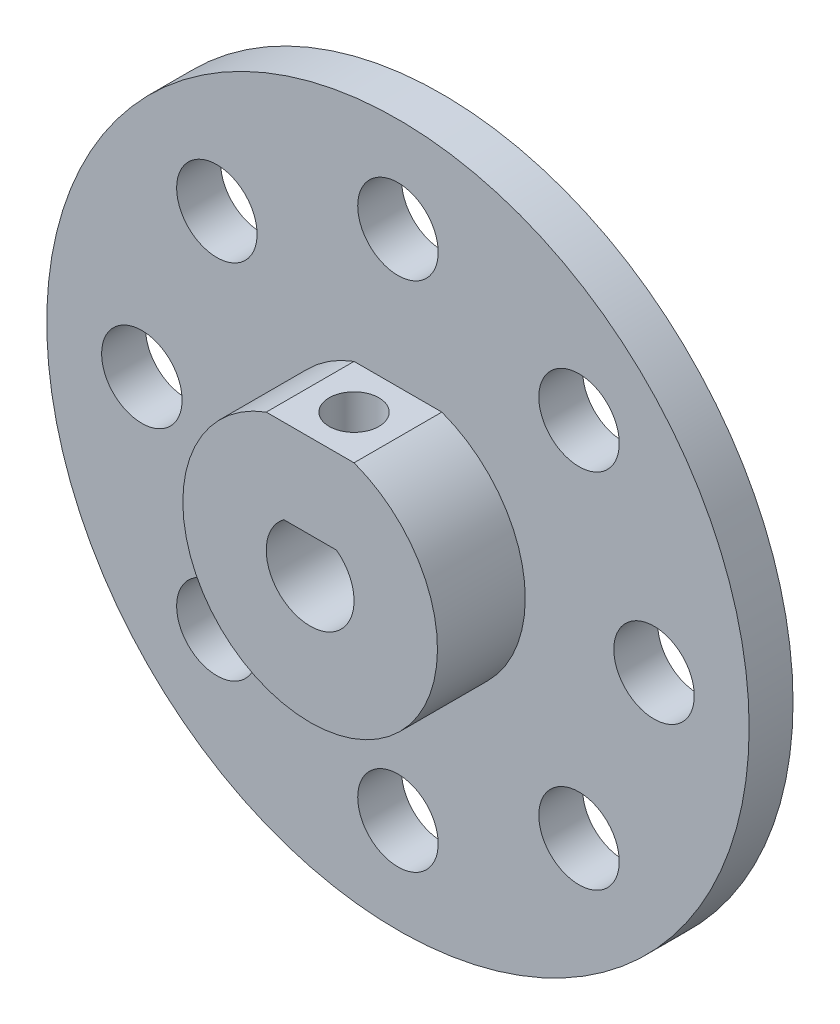
ISO-10303-21;
HEADER;
FILE_DESCRIPTION(('STEP AP214'),'2;1');
FILE_NAME('part.step','',(''),(''),'','','');
FILE_SCHEMA(('AUTOMOTIVE_DESIGN { 1 0 10303 214 1 1 1 1 }'));
ENDSEC;
DATA;
#1=APPLICATION_CONTEXT('core data for automotive mechanical design processes');
#2=APPLICATION_PROTOCOL_DEFINITION('international standard','automotive_design',2000,#1);
#3=PRODUCT_CONTEXT('',#1,'mechanical');
#4=PRODUCT('Part','Part','',(#3));
#5=PRODUCT_RELATED_PRODUCT_CATEGORY('part','',(#4));
#6=PRODUCT_DEFINITION_FORMATION('','',#4);
#7=PRODUCT_DEFINITION_CONTEXT('part definition',#1,'design');
#8=PRODUCT_DEFINITION('design','',#6,#7);
#9=PRODUCT_DEFINITION_SHAPE('','',#8);
#10=(LENGTH_UNIT() NAMED_UNIT(*) SI_UNIT(.MILLI.,.METRE.));
#11=(NAMED_UNIT(*) PLANE_ANGLE_UNIT() SI_UNIT($,.RADIAN.));
#12=(NAMED_UNIT(*) SI_UNIT($,.STERADIAN.) SOLID_ANGLE_UNIT());
#13=UNCERTAINTY_MEASURE_WITH_UNIT(LENGTH_MEASURE(1.E-05),#10,'distance_accuracy_value','');
#14=(GEOMETRIC_REPRESENTATION_CONTEXT(3) GLOBAL_UNCERTAINTY_ASSIGNED_CONTEXT((#13)) GLOBAL_UNIT_ASSIGNED_CONTEXT((#10,
#11,#12)) REPRESENTATION_CONTEXT('',''));
#15=CARTESIAN_POINT('',(0.,0.,0.));
#16=DIRECTION('',(0.,0.,1.));
#17=DIRECTION('',(1.,0.,0.));
#18=AXIS2_PLACEMENT_3D('',#15,#16,#17);
#19=CARTESIAN_POINT('',(0.,9.00000000000001,-3.75));
#20=DIRECTION('',(0.,0.,1.));
#21=DIRECTION('',(1.,0.,0.));
#22=AXIS2_PLACEMENT_3D('',#19,#20,#21);
#23=PLANE('',#22);
#24=CARTESIAN_POINT('',(0.,17.5,-3.75));
#25=DIRECTION('',(0.,0.,-1.));
#26=DIRECTION('',(-1.,0.,0.));
#27=AXIS2_PLACEMENT_3D('',#24,#25,#26);
#28=CIRCLE('',#27,2.74999999999999);
#29=CARTESIAN_POINT('',(-2.74999999999999,17.5,-3.75));
#30=VERTEX_POINT('',#29);
#31=EDGE_CURVE('E221',#30,#30,#28,.T.);
#32=ORIENTED_EDGE('',*,*,#31,.F.);
#33=EDGE_LOOP('',(#32));
#34=FACE_BOUND('',#33,.T.);
#35=CARTESIAN_POINT('',(-9.88330434368617E-13,-17.5,-3.75));
#36=DIRECTION('',(0.,0.,-1.));
#37=DIRECTION('',(-1.,0.,0.));
#38=AXIS2_PLACEMENT_3D('',#35,#36,#37);
#39=CIRCLE('',#38,2.74999999999999);
#40=CARTESIAN_POINT('',(-2.75000000000098,-17.5,-3.75));
#41=VERTEX_POINT('',#40);
#42=EDGE_CURVE('E253',#41,#41,#39,.T.);
#43=ORIENTED_EDGE('',*,*,#42,.F.);
#44=EDGE_LOOP('',(#43));
#45=FACE_BOUND('',#44,.T.);
#46=CARTESIAN_POINT('',(12.3743686707637,-12.3743686707649,-3.75));
#47=DIRECTION('',(0.,0.,-1.));
#48=DIRECTION('',(-1.,0.,0.));
#49=AXIS2_PLACEMENT_3D('',#46,#47,#48);
#50=CIRCLE('',#49,2.74999999999999);
#51=CARTESIAN_POINT('',(9.62436867076375,-12.3743686707649,-3.75));
#52=VERTEX_POINT('',#51);
#53=EDGE_CURVE('E261',#52,#52,#50,.T.);
#54=ORIENTED_EDGE('',*,*,#53,.F.);
#55=EDGE_LOOP('',(#54));
#56=FACE_BOUND('',#55,.T.);
#57=CARTESIAN_POINT('',(12.3743686707644,12.3743686707642,-3.75));
#58=DIRECTION('',(0.,0.,-1.));
#59=DIRECTION('',(-1.,0.,0.));
#60=AXIS2_PLACEMENT_3D('',#57,#58,#59);
#61=CIRCLE('',#60,2.74999999999999);
#62=CARTESIAN_POINT('',(9.62436867076445,12.3743686707642,-3.75));
#63=VERTEX_POINT('',#62);
#64=EDGE_CURVE('E277',#63,#63,#61,.T.);
#65=ORIENTED_EDGE('',*,*,#64,.F.);
#66=EDGE_LOOP('',(#65));
#67=FACE_BOUND('',#66,.T.);
#68=CARTESIAN_POINT('',(0.,0.,-3.74999999999999));
#69=DIRECTION('',(0.,0.,1.));
#70=DIRECTION('',(1.,0.,0.));
#71=AXIS2_PLACEMENT_3D('',#68,#69,#70);
#72=CIRCLE('',#71,24.);
#73=CARTESIAN_POINT('',(24.,0.,-3.74999999999999));
#74=VERTEX_POINT('',#73);
#75=EDGE_CURVE('E111',#74,#74,#72,.T.);
#76=ORIENTED_EDGE('',*,*,#75,.F.);
#77=EDGE_LOOP('',(#76));
#78=FACE_BOUND('',#77,.T.);
#79=CARTESIAN_POINT('',(0.,0.,-3.75));
#80=DIRECTION('',(0.,0.,1.));
#81=DIRECTION('',(1.,0.,0.));
#82=AXIS2_PLACEMENT_3D('',#79,#80,#81);
#83=CIRCLE('',#82,9.00000000000001);
#84=CARTESIAN_POINT('',(9.00000000000001,0.,-3.75));
#85=VERTEX_POINT('',#84);
#86=EDGE_CURVE('E54',#85,#85,#83,.T.);
#87=ORIENTED_EDGE('',*,*,#86,.T.);
#88=EDGE_LOOP('',(#87));
#89=FACE_BOUND('',#88,.T.);
#90=CARTESIAN_POINT('',(17.4999999999995,-4.96308349082816E-13,-3.75));
#91=DIRECTION('',(0.,0.,-1.));
#92=DIRECTION('',(-1.,0.,0.));
#93=AXIS2_PLACEMENT_3D('',#90,#91,#92);
#94=CIRCLE('',#93,2.74999999999999);
#95=CARTESIAN_POINT('',(14.7499999999995,-4.96308349082816E-13,-3.75));
#96=VERTEX_POINT('',#95);
#97=EDGE_CURVE('E269',#96,#96,#94,.T.);
#98=ORIENTED_EDGE('',*,*,#97,.F.);
#99=EDGE_LOOP('',(#98));
#100=FACE_BOUND('',#99,.T.);
#101=CARTESIAN_POINT('',(-12.3743686707654,-12.3743686707642,-3.75));
#102=DIRECTION('',(0.,0.,-1.));
#103=DIRECTION('',(-1.,0.,0.));
#104=AXIS2_PLACEMENT_3D('',#101,#102,#103);
#105=CIRCLE('',#104,2.74999999999999);
#106=CARTESIAN_POINT('',(-15.1243686707654,-12.3743686707642,-3.75));
#107=VERTEX_POINT('',#106);
#108=EDGE_CURVE('E245',#107,#107,#105,.T.);
#109=ORIENTED_EDGE('',*,*,#108,.F.);
#110=EDGE_LOOP('',(#109));
#111=FACE_BOUND('',#110,.T.);
#112=CARTESIAN_POINT('',(-17.5000000000005,4.94165217184309E-13,-3.75));
#113=DIRECTION('',(0.,0.,-1.));
#114=DIRECTION('',(-1.,0.,0.));
#115=AXIS2_PLACEMENT_3D('',#112,#113,#114);
#116=CIRCLE('',#115,2.74999999999999);
#117=CARTESIAN_POINT('',(-20.2500000000005,4.94165217184309E-13,-3.75));
#118=VERTEX_POINT('',#117);
#119=EDGE_CURVE('E237',#118,#118,#116,.T.);
#120=ORIENTED_EDGE('',*,*,#119,.F.);
#121=EDGE_LOOP('',(#120));
#122=FACE_BOUND('',#121,.T.);
#123=CARTESIAN_POINT('',(-12.3743686707646,12.3743686707646,-3.75));
#124=DIRECTION('',(0.,0.,-1.));
#125=DIRECTION('',(-1.,0.,0.));
#126=AXIS2_PLACEMENT_3D('',#123,#124,#125);
#127=CIRCLE('',#126,2.74999999999999);
#128=CARTESIAN_POINT('',(-15.1243686707646,12.3743686707646,-3.75));
#129=VERTEX_POINT('',#128);
#130=EDGE_CURVE('E229',#129,#129,#127,.T.);
#131=ORIENTED_EDGE('',*,*,#130,.F.);
#132=EDGE_LOOP('',(#131));
#133=FACE_BOUND('',#132,.T.);
#134=ADVANCED_FACE('F45',(#34,#45,#56,#67,#78,#89,#100,#111,#122,#133),#23,.F.);
#135=CARTESIAN_POINT('',(0.,8.7,5.25));
#136=DIRECTION('',(0.,0.,-1.));
#137=DIRECTION('',(-1.,0.,0.));
#138=AXIS2_PLACEMENT_3D('',#135,#136,#137);
#139=PLANE('',#138);
#140=DIRECTION('',(-1.,0.,0.));
#141=VECTOR('',#140,1.);
#142=CARTESIAN_POINT('',(-1.8,2.4,5.25));
#143=LINE('',#142,#141);
#144=CARTESIAN_POINT('',(1.8,2.4,5.25));
#145=VERTEX_POINT('',#144);
#146=CARTESIAN_POINT('',(-1.8,2.4,5.25));
#147=VERTEX_POINT('',#146);
#148=EDGE_CURVE('E290',#145,#147,#143,.T.);
#149=ORIENTED_EDGE('',*,*,#148,.F.);
#150=CARTESIAN_POINT('',(0.,0.,5.25));
#151=DIRECTION('',(0.,0.,1.));
#152=DIRECTION('',(1.,0.,0.));
#153=AXIS2_PLACEMENT_3D('',#150,#151,#152);
#154=CIRCLE('',#153,3.);
#155=EDGE_CURVE('E69',#147,#145,#154,.T.);
#156=ORIENTED_EDGE('',*,*,#155,.F.);
#157=EDGE_LOOP('',(#149,#156));
#158=FACE_BOUND('',#157,.T.);
#159=CARTESIAN_POINT('',(0.,0.,5.25));
#160=DIRECTION('',(0.,0.,1.));
#161=DIRECTION('',(1.,0.,0.));
#162=AXIS2_PLACEMENT_3D('',#159,#160,#161);
#163=CIRCLE('',#162,8.7);
#164=CARTESIAN_POINT('',(-3.,8.16639455328973,5.25));
#165=VERTEX_POINT('',#164);
#166=CARTESIAN_POINT('',(3.,8.16639455328973,5.25));
#167=VERTEX_POINT('',#166);
#168=EDGE_CURVE('E106',#165,#167,#163,.T.);
#169=ORIENTED_EDGE('',*,*,#168,.T.);
#170=DIRECTION('',(1.,0.,0.));
#171=VECTOR('',#170,1.);
#172=CARTESIAN_POINT('',(-3.,8.16639455328973,5.25));
#173=LINE('',#172,#171);
#174=EDGE_CURVE('E88',#165,#167,#173,.T.);
#175=ORIENTED_EDGE('',*,*,#174,.F.);
#176=EDGE_LOOP('',(#169,#175));
#177=FACE_BOUND('',#176,.T.);
#178=ADVANCED_FACE('F47',(#158,#177),#139,.F.);
#179=CARTESIAN_POINT('',(0.,0.,-5.25));
#180=DIRECTION('',(0.,0.,1.));
#181=DIRECTION('',(1.,0.,0.));
#182=AXIS2_PLACEMENT_3D('',#179,#180,#181);
#183=PLANE('',#182);
#184=CARTESIAN_POINT('',(0.,0.,-5.25));
#185=DIRECTION('',(0.,0.,1.));
#186=DIRECTION('',(1.,0.,0.));
#187=AXIS2_PLACEMENT_3D('',#184,#185,#186);
#188=CIRCLE('',#187,9.00000000000001);
#189=CARTESIAN_POINT('',(9.00000000000001,0.,-5.25));
#190=VERTEX_POINT('',#189);
#191=EDGE_CURVE('E11',#190,#190,#188,.T.);
#192=ORIENTED_EDGE('',*,*,#191,.F.);
#193=EDGE_LOOP('',(#192));
#194=FACE_BOUND('',#193,.T.);
#195=ADVANCED_FACE('F129',(#194),#183,.F.);
#196=CARTESIAN_POINT('',(0.,0.,25.6232345338686));
#197=DIRECTION('',(0.,0.,1.));
#198=DIRECTION('',(1.,0.,0.));
#199=AXIS2_PLACEMENT_3D('',#196,#197,#198);
#200=CYLINDRICAL_SURFACE('',#199,9.00000000000001);
#201=ORIENTED_EDGE('',*,*,#86,.F.);
#202=EDGE_LOOP('',(#201));
#203=FACE_BOUND('',#202,.T.);
#204=ORIENTED_EDGE('',*,*,#191,.T.);
#205=EDGE_LOOP('',(#204));
#206=FACE_BOUND('',#205,.T.);
#207=ADVANCED_FACE('F125',(#203,#206),#200,.T.);
#208=CARTESIAN_POINT('',(0.,0.,25.6232345338686));
#209=DIRECTION('',(0.,0.,1.));
#210=DIRECTION('',(1.,0.,0.));
#211=AXIS2_PLACEMENT_3D('',#208,#209,#210);
#212=CYLINDRICAL_SURFACE('',#211,24.);
#213=CARTESIAN_POINT('',(0.,0.,-0.749999999999994));
#214=DIRECTION('',(0.,0.,1.));
#215=DIRECTION('',(1.,0.,0.));
#216=AXIS2_PLACEMENT_3D('',#213,#214,#215);
#217=CIRCLE('',#216,24.);
#218=CARTESIAN_POINT('',(24.,0.,-0.749999999999994));
#219=VERTEX_POINT('',#218);
#220=EDGE_CURVE('E105',#219,#219,#217,.T.);
#221=ORIENTED_EDGE('',*,*,#220,.F.);
#222=EDGE_LOOP('',(#221));
#223=FACE_BOUND('',#222,.T.);
#224=ORIENTED_EDGE('',*,*,#75,.T.);
#225=EDGE_LOOP('',(#224));
#226=FACE_BOUND('',#225,.T.);
#227=ADVANCED_FACE('F128',(#223,#226),#212,.T.);
#228=CARTESIAN_POINT('',(0.,24.,-0.749999999999997));
#229=DIRECTION('',(0.,0.,-1.));
#230=DIRECTION('',(-1.,0.,0.));
#231=AXIS2_PLACEMENT_3D('',#228,#229,#230);
#232=PLANE('',#231);
#233=CARTESIAN_POINT('',(0.,17.5,-0.749999999999997));
#234=DIRECTION('',(0.,0.,-1.));
#235=DIRECTION('',(-1.,0.,0.));
#236=AXIS2_PLACEMENT_3D('',#233,#234,#235);
#237=CIRCLE('',#236,2.74999999999999);
#238=CARTESIAN_POINT('',(-2.74999999999999,17.5,-0.749999999999997));
#239=VERTEX_POINT('',#238);
#240=EDGE_CURVE('E225',#239,#239,#237,.T.);
#241=ORIENTED_EDGE('',*,*,#240,.T.);
#242=EDGE_LOOP('',(#241));
#243=FACE_BOUND('',#242,.T.);
#244=CARTESIAN_POINT('',(-12.3743686707646,12.3743686707646,-0.749999999999997));
#245=DIRECTION('',(0.,0.,-1.));
#246=DIRECTION('',(-1.,0.,0.));
#247=AXIS2_PLACEMENT_3D('',#244,#245,#246);
#248=CIRCLE('',#247,2.74999999999999);
#249=CARTESIAN_POINT('',(-15.1243686707646,12.3743686707646,-0.749999999999997));
#250=VERTEX_POINT('',#249);
#251=EDGE_CURVE('E233',#250,#250,#248,.T.);
#252=ORIENTED_EDGE('',*,*,#251,.T.);
#253=EDGE_LOOP('',(#252));
#254=FACE_BOUND('',#253,.T.);
#255=CARTESIAN_POINT('',(-17.5000000000005,4.94165217184309E-13,-0.749999999999997));
#256=DIRECTION('',(0.,0.,-1.));
#257=DIRECTION('',(-1.,0.,0.));
#258=AXIS2_PLACEMENT_3D('',#255,#256,#257);
#259=CIRCLE('',#258,2.74999999999999);
#260=CARTESIAN_POINT('',(-20.2500000000005,4.94165217184309E-13,-0.749999999999997));
#261=VERTEX_POINT('',#260);
#262=EDGE_CURVE('E241',#261,#261,#259,.T.);
#263=ORIENTED_EDGE('',*,*,#262,.T.);
#264=EDGE_LOOP('',(#263));
#265=FACE_BOUND('',#264,.T.);
#266=CARTESIAN_POINT('',(-12.3743686707654,-12.3743686707642,-0.749999999999997));
#267=DIRECTION('',(0.,0.,-1.));
#268=DIRECTION('',(-1.,0.,0.));
#269=AXIS2_PLACEMENT_3D('',#266,#267,#268);
#270=CIRCLE('',#269,2.74999999999999);
#271=CARTESIAN_POINT('',(-15.1243686707654,-12.3743686707642,-0.749999999999997));
#272=VERTEX_POINT('',#271);
#273=EDGE_CURVE('E249',#272,#272,#270,.T.);
#274=ORIENTED_EDGE('',*,*,#273,.T.);
#275=EDGE_LOOP('',(#274));
#276=FACE_BOUND('',#275,.T.);
#277=CARTESIAN_POINT('',(-9.88330434368617E-13,-17.5,-0.749999999999997));
#278=DIRECTION('',(0.,0.,-1.));
#279=DIRECTION('',(-1.,0.,0.));
#280=AXIS2_PLACEMENT_3D('',#277,#278,#279);
#281=CIRCLE('',#280,2.74999999999999);
#282=CARTESIAN_POINT('',(-2.75000000000098,-17.5,-0.749999999999997));
#283=VERTEX_POINT('',#282);
#284=EDGE_CURVE('E257',#283,#283,#281,.T.);
#285=ORIENTED_EDGE('',*,*,#284,.T.);
#286=EDGE_LOOP('',(#285));
#287=FACE_BOUND('',#286,.T.);
#288=CARTESIAN_POINT('',(12.3743686707637,-12.3743686707649,-0.749999999999997));
#289=DIRECTION('',(0.,0.,-1.));
#290=DIRECTION('',(-1.,0.,0.));
#291=AXIS2_PLACEMENT_3D('',#288,#289,#290);
#292=CIRCLE('',#291,2.74999999999999);
#293=CARTESIAN_POINT('',(9.62436867076375,-12.3743686707649,-0.749999999999997));
#294=VERTEX_POINT('',#293);
#295=EDGE_CURVE('E265',#294,#294,#292,.T.);
#296=ORIENTED_EDGE('',*,*,#295,.T.);
#297=EDGE_LOOP('',(#296));
#298=FACE_BOUND('',#297,.T.);
#299=CARTESIAN_POINT('',(17.4999999999995,-4.96308349082816E-13,-0.749999999999997));
#300=DIRECTION('',(0.,0.,-1.));
#301=DIRECTION('',(-1.,0.,0.));
#302=AXIS2_PLACEMENT_3D('',#299,#300,#301);
#303=CIRCLE('',#302,2.74999999999999);
#304=CARTESIAN_POINT('',(14.7499999999995,-4.96308349082816E-13,-0.749999999999997));
#305=VERTEX_POINT('',#304);
#306=EDGE_CURVE('E273',#305,#305,#303,.T.);
#307=ORIENTED_EDGE('',*,*,#306,.T.);
#308=EDGE_LOOP('',(#307));
#309=FACE_BOUND('',#308,.T.);
#310=CARTESIAN_POINT('',(12.3743686707644,12.3743686707642,-0.749999999999997));
#311=DIRECTION('',(0.,0.,-1.));
#312=DIRECTION('',(-1.,0.,0.));
#313=AXIS2_PLACEMENT_3D('',#310,#311,#312);
#314=CIRCLE('',#313,2.74999999999999);
#315=CARTESIAN_POINT('',(9.62436867076445,12.3743686707642,-0.749999999999997));
#316=VERTEX_POINT('',#315);
#317=EDGE_CURVE('E281',#316,#316,#314,.T.);
#318=ORIENTED_EDGE('',*,*,#317,.T.);
#319=EDGE_LOOP('',(#318));
#320=FACE_BOUND('',#319,.T.);
#321=CARTESIAN_POINT('',(0.,0.,-0.750000000000001));
#322=DIRECTION('',(0.,0.,1.));
#323=DIRECTION('',(1.,0.,0.));
#324=AXIS2_PLACEMENT_3D('',#321,#322,#323);
#325=CIRCLE('',#324,8.7);
#326=CARTESIAN_POINT('',(-2.99999999999999,8.16639455328973,-0.750000000000001));
#327=VERTEX_POINT('',#326);
#328=CARTESIAN_POINT('',(3.,8.16639455328973,-0.749999999999997));
#329=VERTEX_POINT('',#328);
#330=EDGE_CURVE('E100',#327,#329,#325,.T.);
#331=ORIENTED_EDGE('',*,*,#330,.F.);
#332=DIRECTION('',(1.,0.,0.));
#333=VECTOR('',#332,1.);
#334=CARTESIAN_POINT('',(-3.,8.16639455328973,-0.749999999999997));
#335=LINE('',#334,#333);
#336=EDGE_CURVE('E61',#327,#329,#335,.T.);
#337=ORIENTED_EDGE('',*,*,#336,.T.);
#338=EDGE_LOOP('',(#331,#337));
#339=FACE_BOUND('',#338,.T.);
#340=ORIENTED_EDGE('',*,*,#220,.T.);
#341=EDGE_LOOP('',(#340));
#342=FACE_BOUND('',#341,.T.);
#343=ADVANCED_FACE('F98',(#243,#254,#265,#276,#287,#298,#309,#320,#339,#342),#232,.F.);
#344=CARTESIAN_POINT('',(0.,0.,25.6232345338686));
#345=DIRECTION('',(0.,0.,1.));
#346=DIRECTION('',(1.,0.,0.));
#347=AXIS2_PLACEMENT_3D('',#344,#345,#346);
#348=CYLINDRICAL_SURFACE('',#347,8.7);
#349=ORIENTED_EDGE('',*,*,#330,.T.);
#350=DIRECTION('',(0.,0.,1.));
#351=VECTOR('',#350,1.);
#352=CARTESIAN_POINT('',(3.,8.16639455328973,-6.77368116460017));
#353=LINE('',#352,#351);
#354=EDGE_CURVE('E85',#329,#167,#353,.T.);
#355=ORIENTED_EDGE('',*,*,#354,.T.);
#356=ORIENTED_EDGE('',*,*,#168,.F.);
#357=DIRECTION('',(0.,0.,1.));
#358=VECTOR('',#357,1.);
#359=CARTESIAN_POINT('',(-3.,8.16639455328973,-6.77368116460017));
#360=LINE('',#359,#358);
#361=EDGE_CURVE('E94',#327,#165,#360,.T.);
#362=ORIENTED_EDGE('',*,*,#361,.F.);
#363=EDGE_LOOP('',(#349,#355,#356,#362));
#364=FACE_BOUND('',#363,.T.);
#365=ADVANCED_FACE('F103',(#364),#348,.T.);
#366=CARTESIAN_POINT('',(0.,0.,-4.75));
#367=DIRECTION('',(0.,0.,1.));
#368=DIRECTION('',(1.,0.,0.));
#369=AXIS2_PLACEMENT_3D('',#366,#367,#368);
#370=CYLINDRICAL_SURFACE('',#369,3.);
#371=ORIENTED_EDGE('',*,*,#155,.T.);
#372=DIRECTION('',(0.,0.,1.));
#373=VECTOR('',#372,1.);
#374=CARTESIAN_POINT('',(1.8,2.4,-4.75));
#375=LINE('',#374,#373);
#376=CARTESIAN_POINT('',(1.8,2.4,-4.75));
#377=VERTEX_POINT('',#376);
#378=EDGE_CURVE('E294',#377,#145,#375,.T.);
#379=ORIENTED_EDGE('',*,*,#378,.F.);
#380=CARTESIAN_POINT('',(0.,0.,-4.75));
#381=DIRECTION('',(0.,0.,1.));
#382=DIRECTION('',(1.,0.,0.));
#383=AXIS2_PLACEMENT_3D('',#380,#381,#382);
#384=CIRCLE('',#383,3.);
#385=CARTESIAN_POINT('',(-1.8,2.4,-4.75));
#386=VERTEX_POINT('',#385);
#387=EDGE_CURVE('E285',#386,#377,#384,.T.);
#388=ORIENTED_EDGE('',*,*,#387,.F.);
#389=DIRECTION('',(0.,0.,1.));
#390=VECTOR('',#389,1.);
#391=CARTESIAN_POINT('',(-1.8,2.4,-4.75));
#392=LINE('',#391,#390);
#393=EDGE_CURVE('E113',#386,#147,#392,.T.);
#394=ORIENTED_EDGE('',*,*,#393,.T.);
#395=EDGE_LOOP('',(#371,#379,#388,#394));
#396=FACE_BOUND('',#395,.T.);
#397=ADVANCED_FACE('F156',(#396),#370,.F.);
#398=CARTESIAN_POINT('',(-1.8,2.4,-4.75));
#399=DIRECTION('',(0.,1.,0.));
#400=DIRECTION('',(0.,0.,1.));
#401=AXIS2_PLACEMENT_3D('',#398,#399,#400);
#402=PLANE('',#401);
#403=CARTESIAN_POINT('',(0.,2.4,2.25));
#404=DIRECTION('',(0.,1.,0.));
#405=DIRECTION('',(0.,0.,1.));
#406=AXIS2_PLACEMENT_3D('',#403,#404,#405);
#407=CIRCLE('',#406,1.7);
#408=CARTESIAN_POINT('',(0.,2.4,3.95));
#409=VERTEX_POINT('',#408);
#410=EDGE_CURVE('E208',#409,#409,#407,.T.);
#411=ORIENTED_EDGE('',*,*,#410,.T.);
#412=EDGE_LOOP('',(#411));
#413=FACE_BOUND('',#412,.T.);
#414=ORIENTED_EDGE('',*,*,#148,.T.);
#415=ORIENTED_EDGE('',*,*,#393,.F.);
#416=DIRECTION('',(-1.,0.,0.));
#417=VECTOR('',#416,1.);
#418=CARTESIAN_POINT('',(-1.8,2.4,-4.75));
#419=LINE('',#418,#417);
#420=EDGE_CURVE('E289',#377,#386,#419,.T.);
#421=ORIENTED_EDGE('',*,*,#420,.F.);
#422=ORIENTED_EDGE('',*,*,#378,.T.);
#423=EDGE_LOOP('',(#414,#415,#421,#422));
#424=FACE_BOUND('',#423,.T.);
#425=ADVANCED_FACE('F159',(#413,#424),#402,.F.);
#426=CARTESIAN_POINT('',(0.,0.,-4.75));
#427=DIRECTION('',(0.,0.,1.));
#428=DIRECTION('',(1.,0.,0.));
#429=AXIS2_PLACEMENT_3D('',#426,#427,#428);
#430=PLANE('',#429);
#431=ORIENTED_EDGE('',*,*,#387,.T.);
#432=ORIENTED_EDGE('',*,*,#420,.T.);
#433=EDGE_LOOP('',(#431,#432));
#434=FACE_BOUND('',#433,.T.);
#435=ADVANCED_FACE('F162',(#434),#430,.T.);
#436=CARTESIAN_POINT('',(12.3743686707644,12.3743686707642,-3.75));
#437=DIRECTION('',(0.,0.,-1.));
#438=DIRECTION('',(-1.,0.,0.));
#439=AXIS2_PLACEMENT_3D('',#436,#437,#438);
#440=CYLINDRICAL_SURFACE('',#439,2.74999999999999);
#441=ORIENTED_EDGE('',*,*,#317,.F.);
#442=EDGE_LOOP('',(#441));
#443=FACE_BOUND('',#442,.T.);
#444=ORIENTED_EDGE('',*,*,#64,.T.);
#445=EDGE_LOOP('',(#444));
#446=FACE_BOUND('',#445,.T.);
#447=ADVANCED_FACE('F165',(#443,#446),#440,.F.);
#448=CARTESIAN_POINT('',(17.4999999999995,-4.96308349082816E-13,-3.75));
#449=DIRECTION('',(0.,0.,-1.));
#450=DIRECTION('',(-1.,0.,0.));
#451=AXIS2_PLACEMENT_3D('',#448,#449,#450);
#452=CYLINDRICAL_SURFACE('',#451,2.74999999999999);
#453=ORIENTED_EDGE('',*,*,#306,.F.);
#454=EDGE_LOOP('',(#453));
#455=FACE_BOUND('',#454,.T.);
#456=ORIENTED_EDGE('',*,*,#97,.T.);
#457=EDGE_LOOP('',(#456));
#458=FACE_BOUND('',#457,.T.);
#459=ADVANCED_FACE('F168',(#455,#458),#452,.F.);
#460=CARTESIAN_POINT('',(12.3743686707637,-12.3743686707649,-3.75));
#461=DIRECTION('',(0.,0.,-1.));
#462=DIRECTION('',(-1.,0.,0.));
#463=AXIS2_PLACEMENT_3D('',#460,#461,#462);
#464=CYLINDRICAL_SURFACE('',#463,2.74999999999999);
#465=ORIENTED_EDGE('',*,*,#295,.F.);
#466=EDGE_LOOP('',(#465));
#467=FACE_BOUND('',#466,.T.);
#468=ORIENTED_EDGE('',*,*,#53,.T.);
#469=EDGE_LOOP('',(#468));
#470=FACE_BOUND('',#469,.T.);
#471=ADVANCED_FACE('F172',(#467,#470),#464,.F.);
#472=CARTESIAN_POINT('',(-9.88330434368617E-13,-17.5,-3.75));
#473=DIRECTION('',(0.,0.,-1.));
#474=DIRECTION('',(-1.,0.,0.));
#475=AXIS2_PLACEMENT_3D('',#472,#473,#474);
#476=CYLINDRICAL_SURFACE('',#475,2.74999999999999);
#477=ORIENTED_EDGE('',*,*,#284,.F.);
#478=EDGE_LOOP('',(#477));
#479=FACE_BOUND('',#478,.T.);
#480=ORIENTED_EDGE('',*,*,#42,.T.);
#481=EDGE_LOOP('',(#480));
#482=FACE_BOUND('',#481,.T.);
#483=ADVANCED_FACE('F176',(#479,#482),#476,.F.);
#484=CARTESIAN_POINT('',(-12.3743686707654,-12.3743686707642,-3.75));
#485=DIRECTION('',(0.,0.,-1.));
#486=DIRECTION('',(-1.,0.,0.));
#487=AXIS2_PLACEMENT_3D('',#484,#485,#486);
#488=CYLINDRICAL_SURFACE('',#487,2.74999999999999);
#489=ORIENTED_EDGE('',*,*,#273,.F.);
#490=EDGE_LOOP('',(#489));
#491=FACE_BOUND('',#490,.T.);
#492=ORIENTED_EDGE('',*,*,#108,.T.);
#493=EDGE_LOOP('',(#492));
#494=FACE_BOUND('',#493,.T.);
#495=ADVANCED_FACE('F180',(#491,#494),#488,.F.);
#496=CARTESIAN_POINT('',(-17.5000000000005,4.94165217184309E-13,-3.75));
#497=DIRECTION('',(0.,0.,-1.));
#498=DIRECTION('',(-1.,0.,0.));
#499=AXIS2_PLACEMENT_3D('',#496,#497,#498);
#500=CYLINDRICAL_SURFACE('',#499,2.74999999999999);
#501=ORIENTED_EDGE('',*,*,#262,.F.);
#502=EDGE_LOOP('',(#501));
#503=FACE_BOUND('',#502,.T.);
#504=ORIENTED_EDGE('',*,*,#119,.T.);
#505=EDGE_LOOP('',(#504));
#506=FACE_BOUND('',#505,.T.);
#507=ADVANCED_FACE('F184',(#503,#506),#500,.F.);
#508=CARTESIAN_POINT('',(-12.3743686707646,12.3743686707646,-3.75));
#509=DIRECTION('',(0.,0.,-1.));
#510=DIRECTION('',(-1.,0.,0.));
#511=AXIS2_PLACEMENT_3D('',#508,#509,#510);
#512=CYLINDRICAL_SURFACE('',#511,2.74999999999999);
#513=ORIENTED_EDGE('',*,*,#251,.F.);
#514=EDGE_LOOP('',(#513));
#515=FACE_BOUND('',#514,.T.);
#516=ORIENTED_EDGE('',*,*,#130,.T.);
#517=EDGE_LOOP('',(#516));
#518=FACE_BOUND('',#517,.T.);
#519=ADVANCED_FACE('F188',(#515,#518),#512,.F.);
#520=CARTESIAN_POINT('',(0.,17.5,-3.75));
#521=DIRECTION('',(0.,0.,-1.));
#522=DIRECTION('',(-1.,0.,0.));
#523=AXIS2_PLACEMENT_3D('',#520,#521,#522);
#524=CYLINDRICAL_SURFACE('',#523,2.74999999999999);
#525=ORIENTED_EDGE('',*,*,#240,.F.);
#526=EDGE_LOOP('',(#525));
#527=FACE_BOUND('',#526,.T.);
#528=ORIENTED_EDGE('',*,*,#31,.T.);
#529=EDGE_LOOP('',(#528));
#530=FACE_BOUND('',#529,.T.);
#531=ADVANCED_FACE('F192',(#527,#530),#524,.F.);
#532=CARTESIAN_POINT('',(-3.,8.16639455328973,-6.77368116460017));
#533=DIRECTION('',(0.,-1.,0.));
#534=DIRECTION('',(0.,0.,-1.));
#535=AXIS2_PLACEMENT_3D('',#532,#533,#534);
#536=PLANE('',#535);
#537=CARTESIAN_POINT('',(0.,8.16639455328973,2.25));
#538=DIRECTION('',(0.,1.,0.));
#539=DIRECTION('',(0.,0.,1.));
#540=AXIS2_PLACEMENT_3D('',#537,#538,#539);
#541=CIRCLE('',#540,1.7);
#542=CARTESIAN_POINT('',(0.,8.16639455328973,3.95));
#543=VERTEX_POINT('',#542);
#544=EDGE_CURVE('E211',#543,#543,#541,.T.);
#545=ORIENTED_EDGE('',*,*,#544,.F.);
#546=EDGE_LOOP('',(#545));
#547=FACE_BOUND('',#546,.T.);
#548=ORIENTED_EDGE('',*,*,#361,.T.);
#549=ORIENTED_EDGE('',*,*,#174,.T.);
#550=ORIENTED_EDGE('',*,*,#354,.F.);
#551=ORIENTED_EDGE('',*,*,#336,.F.);
#552=EDGE_LOOP('',(#548,#549,#550,#551));
#553=FACE_BOUND('',#552,.T.);
#554=ADVANCED_FACE('F86',(#547,#553),#536,.F.);
#555=CARTESIAN_POINT('',(0.,8.16639455328973,2.25));
#556=DIRECTION('',(0.,1.,0.));
#557=DIRECTION('',(0.,0.,1.));
#558=AXIS2_PLACEMENT_3D('',#555,#556,#557);
#559=CYLINDRICAL_SURFACE('',#558,1.7);
#560=ORIENTED_EDGE('',*,*,#410,.F.);
#561=EDGE_LOOP('',(#560));
#562=FACE_BOUND('',#561,.T.);
#563=ORIENTED_EDGE('',*,*,#544,.T.);
#564=EDGE_LOOP('',(#563));
#565=FACE_BOUND('',#564,.T.);
#566=ADVANCED_FACE('F199',(#562,#565),#559,.F.);
#567=CLOSED_SHELL('',(#134,#178,#195,#207,#227,#343,#365,#397,#425,#435,#447,#459,#471,#483,
#495,#507,#519,#531,#554,#566));
#568=MANIFOLD_SOLID_BREP('B2',#567);
#569=ADVANCED_BREP_SHAPE_REPRESENTATION('',(#18,#568),#14);
#570=SHAPE_DEFINITION_REPRESENTATION(#9,#569);
ENDSEC;
END-ISO-10303-21;
